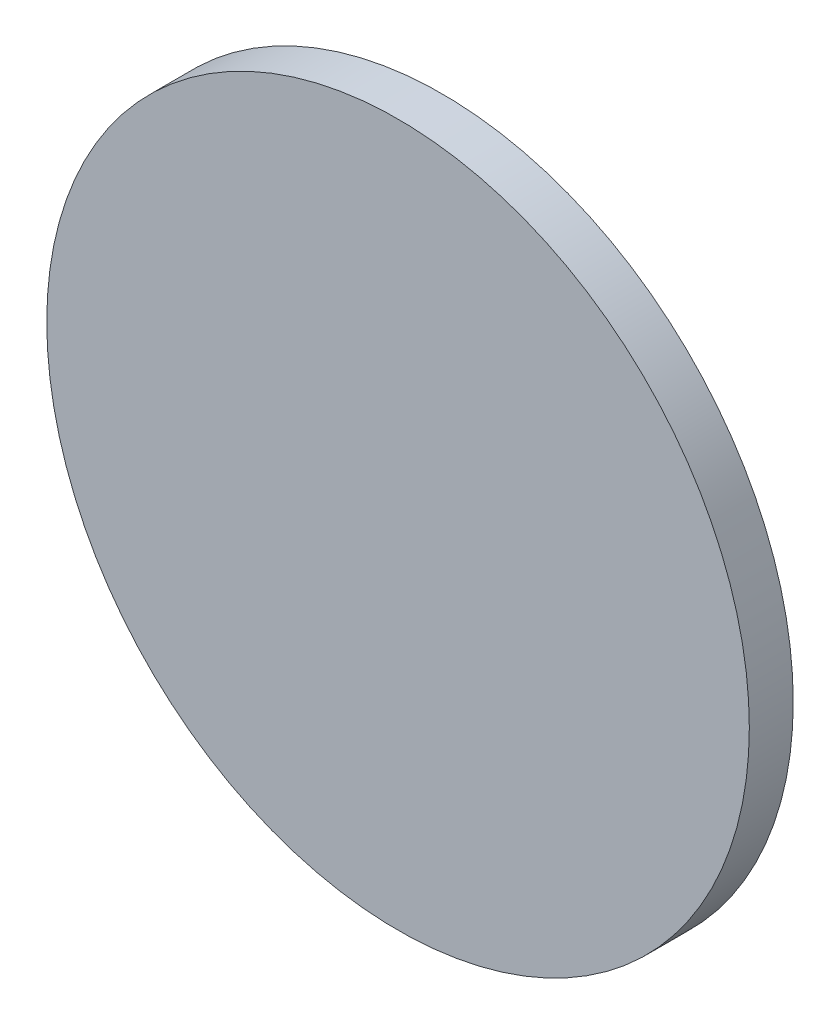
ISO-10303-21;
HEADER;
FILE_DESCRIPTION(('STEP AP214'),'2;1');
FILE_NAME('part.step','',(''),(''),'','','');
FILE_SCHEMA(('AUTOMOTIVE_DESIGN { 1 0 10303 214 1 1 1 1 }'));
ENDSEC;
DATA;
#1=APPLICATION_CONTEXT('core data for automotive mechanical design processes');
#2=APPLICATION_PROTOCOL_DEFINITION('international standard','automotive_design',2000,#1);
#3=PRODUCT_CONTEXT('',#1,'mechanical');
#4=PRODUCT('Part','Part','',(#3));
#5=PRODUCT_RELATED_PRODUCT_CATEGORY('part','',(#4));
#6=PRODUCT_DEFINITION_FORMATION('','',#4);
#7=PRODUCT_DEFINITION_CONTEXT('part definition',#1,'design');
#8=PRODUCT_DEFINITION('design','',#6,#7);
#9=PRODUCT_DEFINITION_SHAPE('','',#8);
#10=(LENGTH_UNIT() NAMED_UNIT(*) SI_UNIT(.MILLI.,.METRE.));
#11=(NAMED_UNIT(*) PLANE_ANGLE_UNIT() SI_UNIT($,.RADIAN.));
#12=(NAMED_UNIT(*) SI_UNIT($,.STERADIAN.) SOLID_ANGLE_UNIT());
#13=UNCERTAINTY_MEASURE_WITH_UNIT(LENGTH_MEASURE(1.E-05),#10,'distance_accuracy_value','');
#14=(GEOMETRIC_REPRESENTATION_CONTEXT(3) GLOBAL_UNCERTAINTY_ASSIGNED_CONTEXT((#13)) GLOBAL_UNIT_ASSIGNED_CONTEXT((#10,
#11,#12)) REPRESENTATION_CONTEXT('',''));
#15=CARTESIAN_POINT('',(0.,0.,0.));
#16=DIRECTION('',(0.,0.,1.));
#17=DIRECTION('',(1.,0.,0.));
#18=AXIS2_PLACEMENT_3D('',#15,#16,#17);
#19=CARTESIAN_POINT('',(0.,0.,3.));
#20=DIRECTION('',(0.,0.,-1.));
#21=DIRECTION('',(-1.,0.,0.));
#22=AXIS2_PLACEMENT_3D('',#19,#20,#21);
#23=CYLINDRICAL_SURFACE('',#22,24.);
#24=CARTESIAN_POINT('',(0.,0.,3.));
#25=DIRECTION('',(0.,0.,1.));
#26=DIRECTION('',(1.,0.,0.));
#27=AXIS2_PLACEMENT_3D('',#24,#25,#26);
#28=CIRCLE('',#27,24.);
#29=CARTESIAN_POINT('',(24.,0.,3.));
#30=VERTEX_POINT('',#29);
#31=EDGE_CURVE('E10',#30,#30,#28,.T.);
#32=ORIENTED_EDGE('',*,*,#31,.F.);
#33=EDGE_LOOP('',(#32));
#34=FACE_BOUND('',#33,.T.);
#35=CARTESIAN_POINT('',(0.,0.,0.));
#36=DIRECTION('',(0.,0.,1.));
#37=DIRECTION('',(1.,0.,0.));
#38=AXIS2_PLACEMENT_3D('',#35,#36,#37);
#39=CIRCLE('',#38,24.);
#40=CARTESIAN_POINT('',(24.,0.,0.));
#41=VERTEX_POINT('',#40);
#42=EDGE_CURVE('E34',#41,#41,#39,.T.);
#43=ORIENTED_EDGE('',*,*,#42,.T.);
#44=EDGE_LOOP('',(#43));
#45=FACE_BOUND('',#44,.T.);
#46=ADVANCED_FACE('F31',(#34,#45),#23,.T.);
#47=CARTESIAN_POINT('',(0.,0.,3.));
#48=DIRECTION('',(0.,0.,1.));
#49=DIRECTION('',(1.,0.,0.));
#50=AXIS2_PLACEMENT_3D('',#47,#48,#49);
#51=PLANE('',#50);
#52=ORIENTED_EDGE('',*,*,#31,.T.);
#53=EDGE_LOOP('',(#52));
#54=FACE_BOUND('',#53,.T.);
#55=ADVANCED_FACE('F46',(#54),#51,.T.);
#56=CARTESIAN_POINT('',(0.,0.,0.));
#57=DIRECTION('',(0.,0.,1.));
#58=DIRECTION('',(1.,0.,0.));
#59=AXIS2_PLACEMENT_3D('',#56,#57,#58);
#60=PLANE('',#59);
#61=ORIENTED_EDGE('',*,*,#42,.F.);
#62=EDGE_LOOP('',(#61));
#63=FACE_BOUND('',#62,.T.);
#64=ADVANCED_FACE('F44',(#63),#60,.F.);
#65=CLOSED_SHELL('',(#46,#55,#64));
#66=MANIFOLD_SOLID_BREP('B2',#65);
#67=ADVANCED_BREP_SHAPE_REPRESENTATION('',(#18,#66),#14);
#68=SHAPE_DEFINITION_REPRESENTATION(#9,#67);
ENDSEC;
END-ISO-10303-21;
